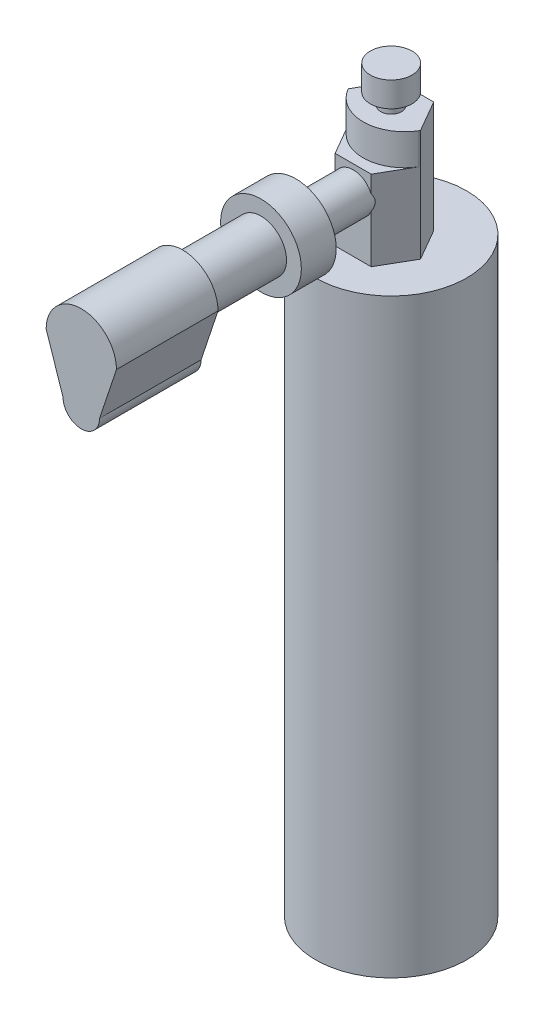
ISO-10303-21;
HEADER;
FILE_DESCRIPTION(('STEP AP214'),'2;1');
FILE_NAME('part.step','',(''),(''),'','','');
FILE_SCHEMA(('AUTOMOTIVE_DESIGN { 1 0 10303 214 1 1 1 1 }'));
ENDSEC;
DATA;
#1=APPLICATION_CONTEXT('core data for automotive mechanical design processes');
#2=APPLICATION_PROTOCOL_DEFINITION('international standard','automotive_design',2000,#1);
#3=PRODUCT_CONTEXT('',#1,'mechanical');
#4=PRODUCT('Part','Part','',(#3));
#5=PRODUCT_RELATED_PRODUCT_CATEGORY('part','',(#4));
#6=PRODUCT_DEFINITION_FORMATION('','',#4);
#7=PRODUCT_DEFINITION_CONTEXT('part definition',#1,'design');
#8=PRODUCT_DEFINITION('design','',#6,#7);
#9=PRODUCT_DEFINITION_SHAPE('','',#8);
#10=(LENGTH_UNIT() NAMED_UNIT(*) SI_UNIT(.MILLI.,.METRE.));
#11=(NAMED_UNIT(*) PLANE_ANGLE_UNIT() SI_UNIT($,.RADIAN.));
#12=(NAMED_UNIT(*) SI_UNIT($,.STERADIAN.) SOLID_ANGLE_UNIT());
#13=UNCERTAINTY_MEASURE_WITH_UNIT(LENGTH_MEASURE(1.E-05),#10,'distance_accuracy_value','');
#14=(GEOMETRIC_REPRESENTATION_CONTEXT(3) GLOBAL_UNCERTAINTY_ASSIGNED_CONTEXT((#13)) GLOBAL_UNIT_ASSIGNED_CONTEXT((#10,
#11,#12)) REPRESENTATION_CONTEXT('',''));
#15=CARTESIAN_POINT('',(0.,0.,0.));
#16=DIRECTION('',(0.,0.,1.));
#17=DIRECTION('',(1.,0.,0.));
#18=AXIS2_PLACEMENT_3D('',#15,#16,#17);
#19=CARTESIAN_POINT('',(0.,124.05,25.));
#20=DIRECTION('',(0.,0.,1.));
#21=DIRECTION('',(1.,0.,0.));
#22=AXIS2_PLACEMENT_3D('',#19,#20,#21);
#23=PLANE('',#22);
#24=CARTESIAN_POINT('',(0.,124.05,25.));
#25=DIRECTION('',(0.,0.,1.));
#26=DIRECTION('',(1.,0.,0.));
#27=AXIS2_PLACEMENT_3D('',#24,#25,#26);
#28=CIRCLE('',#27,7.75);
#29=CARTESIAN_POINT('',(7.75,124.05,25.));
#30=VERTEX_POINT('',#29);
#31=EDGE_CURVE('E169',#30,#30,#28,.T.);
#32=ORIENTED_EDGE('',*,*,#31,.T.);
#33=EDGE_LOOP('',(#32));
#34=FACE_BOUND('',#33,.T.);
#35=CARTESIAN_POINT('',(0.,124.05,25.));
#36=DIRECTION('',(0.,0.,1.));
#37=DIRECTION('',(1.,0.,0.));
#38=AXIS2_PLACEMENT_3D('',#35,#36,#37);
#39=CIRCLE('',#38,4.9);
#40=CARTESIAN_POINT('',(4.9,124.05,25.));
#41=VERTEX_POINT('',#40);
#42=EDGE_CURVE('E157',#41,#41,#39,.T.);
#43=ORIENTED_EDGE('',*,*,#42,.F.);
#44=EDGE_LOOP('',(#43));
#45=FACE_BOUND('',#44,.T.);
#46=ADVANCED_FACE('F32',(#34,#45),#23,.T.);
#47=CARTESIAN_POINT('',(-3.46410161513775,134.8,7.29999999999999));
#48=DIRECTION('',(0.,0.,-1.));
#49=DIRECTION('',(-1.,0.,0.));
#50=AXIS2_PLACEMENT_3D('',#47,#48,#49);
#51=PLANE('',#50);
#52=DIRECTION('',(0.,-1.,0.));
#53=VECTOR('',#52,1.);
#54=CARTESIAN_POINT('',(-3.46410161513775,134.8,7.29999999999999));
#55=LINE('',#54,#53);
#56=CARTESIAN_POINT('',(-3.46410161513775,128.8,7.29999999999999));
#57=VERTEX_POINT('',#56);
#58=CARTESIAN_POINT('',(-3.46410161513775,125.486140661634,7.29999999999999));
#59=VERTEX_POINT('',#58);
#60=EDGE_CURVE('E229',#57,#59,#55,.T.);
#61=ORIENTED_EDGE('',*,*,#60,.T.);
#62=CARTESIAN_POINT('',(0.,124.05,7.29999999999999));
#63=DIRECTION('',(0.,0.,-1.));
#64=DIRECTION('',(-1.,0.,0.));
#65=AXIS2_PLACEMENT_3D('',#62,#63,#64);
#66=CIRCLE('',#65,3.75);
#67=CARTESIAN_POINT('',(3.46410161513775,125.486140661634,7.29999999999999));
#68=VERTEX_POINT('',#67);
#69=EDGE_CURVE('E178',#59,#68,#66,.T.);
#70=ORIENTED_EDGE('',*,*,#69,.T.);
#71=DIRECTION('',(0.,-1.,0.));
#72=VECTOR('',#71,1.);
#73=CARTESIAN_POINT('',(3.46410161513775,134.8,7.29999999999999));
#74=LINE('',#73,#72);
#75=CARTESIAN_POINT('',(3.46410161513775,128.8,7.29999999999999));
#76=VERTEX_POINT('',#75);
#77=EDGE_CURVE('E225',#76,#68,#74,.T.);
#78=ORIENTED_EDGE('',*,*,#77,.F.);
#79=DIRECTION('',(1.,0.,0.));
#80=VECTOR('',#79,1.);
#81=CARTESIAN_POINT('',(-3.46410161513775,128.8,7.29999999999999));
#82=LINE('',#81,#80);
#83=EDGE_CURVE('E54',#57,#76,#82,.T.);
#84=ORIENTED_EDGE('',*,*,#83,.F.);
#85=EDGE_LOOP('',(#61,#70,#78,#84));
#86=FACE_BOUND('',#85,.T.);
#87=ADVANCED_FACE('F281',(#86),#51,.F.);
#88=CARTESIAN_POINT('',(3.46410161513775,122.613859338366,7.29999999999999));
#89=VERTEX_POINT('',#88);
#90=CARTESIAN_POINT('',(3.46410161513775,113.4,7.29999999999999));
#91=VERTEX_POINT('',#90);
#92=EDGE_CURVE('E224',#89,#91,#74,.T.);
#93=ORIENTED_EDGE('',*,*,#92,.F.);
#94=CARTESIAN_POINT('',(-3.46410161513775,122.613859338366,7.29999999999999));
#95=VERTEX_POINT('',#94);
#96=EDGE_CURVE('E47',#89,#95,#66,.T.);
#97=ORIENTED_EDGE('',*,*,#96,.T.);
#98=CARTESIAN_POINT('',(-3.46410161513775,113.4,7.29999999999999));
#99=VERTEX_POINT('',#98);
#100=EDGE_CURVE('E228',#95,#99,#55,.T.);
#101=ORIENTED_EDGE('',*,*,#100,.T.);
#102=DIRECTION('',(1.,0.,0.));
#103=VECTOR('',#102,1.);
#104=CARTESIAN_POINT('',(-3.46410161513775,113.4,7.29999999999999));
#105=LINE('',#104,#103);
#106=EDGE_CURVE('E218',#99,#91,#105,.T.);
#107=ORIENTED_EDGE('',*,*,#106,.T.);
#108=EDGE_LOOP('',(#93,#97,#101,#107));
#109=FACE_BOUND('',#108,.T.);
#110=ADVANCED_FACE('F286',(#109),#51,.F.);
#111=CARTESIAN_POINT('',(0.,141.9,0.));
#112=DIRECTION('',(0.,-1.,0.));
#113=DIRECTION('',(0.,0.,-1.));
#114=AXIS2_PLACEMENT_3D('',#111,#112,#113);
#115=CYLINDRICAL_SURFACE('',#114,2.);
#116=CARTESIAN_POINT('',(0.,134.8,0.));
#117=DIRECTION('',(0.,1.,0.));
#118=DIRECTION('',(0.,0.,1.));
#119=AXIS2_PLACEMENT_3D('',#116,#117,#118);
#120=CIRCLE('',#119,2.);
#121=CARTESIAN_POINT('',(0.,134.8,-2.));
#122=VERTEX_POINT('',#121);
#123=EDGE_CURVE('E239',#122,#122,#120,.T.);
#124=CARTESIAN_POINT('',(0.,137.1,0.));
#125=DIRECTION('',(0.,1.,0.));
#126=DIRECTION('',(0.,0.,1.));
#127=AXIS2_PLACEMENT_3D('',#124,#125,#126);
#128=CIRCLE('',#127,2.);
#129=CARTESIAN_POINT('',(0.,137.1,-2.));
#130=VERTEX_POINT('',#129);
#131=EDGE_CURVE('E250',#130,#130,#128,.T.);
#132=CARTESIAN_POINT('',(0.,134.8,-2.));
#133=CARTESIAN_POINT('',(0.,134.823958333333,-2.));
#134=CARTESIAN_POINT('',(0.,134.847916666667,-2.));
#135=CARTESIAN_POINT('',(0.,134.895833333333,-2.));
#136=CARTESIAN_POINT('',(0.,134.919791666667,-2.));
#137=CARTESIAN_POINT('',(0.,134.967708333333,-2.));
#138=CARTESIAN_POINT('',(0.,134.991666666667,-2.));
#139=CARTESIAN_POINT('',(0.,135.039583333333,-2.));
#140=CARTESIAN_POINT('',(0.,135.063541666667,-2.));
#141=CARTESIAN_POINT('',(0.,135.111458333333,-2.));
#142=CARTESIAN_POINT('',(0.,135.135416666667,-2.));
#143=CARTESIAN_POINT('',(0.,135.183333333333,-2.));
#144=CARTESIAN_POINT('',(0.,135.207291666667,-2.));
#145=CARTESIAN_POINT('',(0.,135.255208333333,-2.));
#146=CARTESIAN_POINT('',(0.,135.279166666667,-2.));
#147=CARTESIAN_POINT('',(0.,135.327083333333,-2.));
#148=CARTESIAN_POINT('',(0.,135.351041666667,-2.));
#149=CARTESIAN_POINT('',(0.,135.398958333333,-2.));
#150=CARTESIAN_POINT('',(0.,135.422916666667,-2.));
#151=CARTESIAN_POINT('',(0.,135.470833333333,-2.));
#152=CARTESIAN_POINT('',(0.,135.494791666667,-2.));
#153=CARTESIAN_POINT('',(0.,135.542708333333,-2.));
#154=CARTESIAN_POINT('',(0.,135.566666666667,-2.));
#155=CARTESIAN_POINT('',(0.,135.614583333333,-2.));
#156=CARTESIAN_POINT('',(0.,135.638541666667,-2.));
#157=CARTESIAN_POINT('',(0.,135.686458333333,-2.));
#158=CARTESIAN_POINT('',(0.,135.710416666667,-2.));
#159=CARTESIAN_POINT('',(0.,135.758333333333,-2.));
#160=CARTESIAN_POINT('',(0.,135.782291666667,-2.));
#161=CARTESIAN_POINT('',(0.,135.830208333333,-2.));
#162=CARTESIAN_POINT('',(0.,135.854166666667,-2.));
#163=CARTESIAN_POINT('',(0.,135.902083333333,-2.));
#164=CARTESIAN_POINT('',(0.,135.926041666667,-2.));
#165=CARTESIAN_POINT('',(0.,135.973958333333,-2.));
#166=CARTESIAN_POINT('',(0.,135.997916666667,-2.));
#167=CARTESIAN_POINT('',(0.,136.045833333333,-2.));
#168=CARTESIAN_POINT('',(0.,136.069791666667,-2.));
#169=CARTESIAN_POINT('',(0.,136.117708333333,-2.));
#170=CARTESIAN_POINT('',(0.,136.141666666667,-2.));
#171=CARTESIAN_POINT('',(0.,136.189583333333,-2.));
#172=CARTESIAN_POINT('',(0.,136.213541666667,-2.));
#173=CARTESIAN_POINT('',(0.,136.261458333333,-2.));
#174=CARTESIAN_POINT('',(0.,136.285416666667,-2.));
#175=CARTESIAN_POINT('',(0.,136.333333333333,-2.));
#176=CARTESIAN_POINT('',(0.,136.357291666667,-2.));
#177=CARTESIAN_POINT('',(0.,136.405208333333,-2.));
#178=CARTESIAN_POINT('',(0.,136.429166666667,-2.));
#179=CARTESIAN_POINT('',(0.,136.477083333333,-2.));
#180=CARTESIAN_POINT('',(0.,136.501041666667,-2.));
#181=CARTESIAN_POINT('',(0.,136.548958333333,-2.));
#182=CARTESIAN_POINT('',(0.,136.572916666667,-2.));
#183=CARTESIAN_POINT('',(0.,136.620833333333,-2.));
#184=CARTESIAN_POINT('',(0.,136.644791666667,-2.));
#185=CARTESIAN_POINT('',(0.,136.692708333333,-2.));
#186=CARTESIAN_POINT('',(0.,136.716666666667,-2.));
#187=CARTESIAN_POINT('',(0.,136.764583333333,-2.));
#188=CARTESIAN_POINT('',(0.,136.788541666667,-2.));
#189=CARTESIAN_POINT('',(0.,136.836458333333,-2.));
#190=CARTESIAN_POINT('',(0.,136.860416666667,-2.));
#191=CARTESIAN_POINT('',(0.,136.908333333333,-2.));
#192=CARTESIAN_POINT('',(0.,136.932291666667,-2.));
#193=CARTESIAN_POINT('',(0.,136.980208333333,-2.));
#194=CARTESIAN_POINT('',(0.,137.004166666667,-2.));
#195=CARTESIAN_POINT('',(0.,137.052083333333,-2.));
#196=CARTESIAN_POINT('',(0.,137.076041666667,-2.));
#197=CARTESIAN_POINT('',(0.,137.1,-2.));
#198=B_SPLINE_CURVE_WITH_KNOTS('',3,(#132,#133,#134,#135,#136,#137,#138,#139,#140,#141,#142,
#143,#144,#145,#146,#147,#148,#149,#150,#151,#152,#153,#154,#155,#156,#157,#158,#159,#160,#161,
#162,#163,#164,#165,#166,#167,#168,#169,#170,#171,#172,#173,#174,#175,#176,#177,#178,#179,#180,
#181,#182,#183,#184,#185,#186,#187,#188,#189,#190,#191,#192,#193,#194,#195,#196,#197),
.UNSPECIFIED.,.F.,.F.,(4,2,2,2,2,2,2,2,2,2,2,2,2,2,2,2,2,2,2,2,2,2,2,2,2,2,2,2,2,2,2,2,4),(0.,
0.071874999999999,0.143749999999998,0.215624999999997,0.287499999999996,0.359374999999995,
0.431249999999994,0.503124999999993,0.574999999999992,0.646874999999991,0.71874999999999,
0.790624999999989,0.862499999999988,0.934374999999987,1.00624999999999,1.07812499999999,
1.14999999999998,1.22187499999998,1.29374999999998,1.36562499999998,1.43749999999998,
1.50937499999998,1.58124999999998,1.65312499999998,1.72499999999998,1.79687499999998,
1.86874999999997,1.94062499999997,2.01249999999997,2.08437499999997,2.15624999999997,
2.22812499999997,2.29999999999997),.UNSPECIFIED.);
#199=EDGE_CURVE('BSEAM345',#122,#130,#198,.T.);
#200=ORIENTED_EDGE('',*,*,#123,.T.);
#201=ORIENTED_EDGE('',*,*,#131,.F.);
#202=ORIENTED_EDGE('',*,*,#199,.T.);
#203=ORIENTED_EDGE('',*,*,#199,.F.);
#204=EDGE_LOOP('',(#200,#202,#201,#203));
#205=FACE_BOUND('',#204,.T.);
#206=ADVANCED_FACE('F345',(#205),#115,.T.);
#207=CARTESIAN_POINT('',(0.,137.1,0.));
#208=DIRECTION('',(0.,1.,0.));
#209=DIRECTION('',(0.,0.,1.));
#210=AXIS2_PLACEMENT_3D('',#207,#208,#209);
#211=PLANE('',#210);
#212=CARTESIAN_POINT('',(0.,137.1,0.));
#213=DIRECTION('',(0.,1.,0.));
#214=DIRECTION('',(0.,0.,1.));
#215=AXIS2_PLACEMENT_3D('',#212,#213,#214);
#216=CIRCLE('',#215,4.);
#217=CARTESIAN_POINT('',(0.,137.1,4.));
#218=VERTEX_POINT('',#217);
#219=EDGE_CURVE('E240',#218,#218,#216,.T.);
#220=ORIENTED_EDGE('',*,*,#219,.F.);
#221=EDGE_LOOP('',(#220));
#222=FACE_BOUND('',#221,.T.);
#223=ORIENTED_EDGE('',*,*,#131,.T.);
#224=EDGE_LOOP('',(#223));
#225=FACE_BOUND('',#224,.T.);
#226=ADVANCED_FACE('F349',(#222,#225),#211,.F.);
#227=CARTESIAN_POINT('',(0.,137.1,0.));
#228=DIRECTION('',(0.,1.,0.));
#229=DIRECTION('',(0.,0.,1.));
#230=AXIS2_PLACEMENT_3D('',#227,#228,#229);
#231=CYLINDRICAL_SURFACE('',#230,4.);
#232=ORIENTED_EDGE('',*,*,#219,.T.);
#233=EDGE_LOOP('',(#232));
#234=FACE_BOUND('',#233,.T.);
#235=CARTESIAN_POINT('',(0.,141.9,0.));
#236=DIRECTION('',(0.,1.,0.));
#237=DIRECTION('',(0.,0.,1.));
#238=AXIS2_PLACEMENT_3D('',#235,#236,#237);
#239=CIRCLE('',#238,4.);
#240=CARTESIAN_POINT('',(0.,141.9,4.));
#241=VERTEX_POINT('',#240);
#242=EDGE_CURVE('E244',#241,#241,#239,.T.);
#243=ORIENTED_EDGE('',*,*,#242,.F.);
#244=EDGE_LOOP('',(#243));
#245=FACE_BOUND('',#244,.T.);
#246=ADVANCED_FACE('F355',(#234,#245),#231,.T.);
#247=CARTESIAN_POINT('',(0.,141.9,0.));
#248=DIRECTION('',(0.,1.,0.));
#249=DIRECTION('',(0.,0.,1.));
#250=AXIS2_PLACEMENT_3D('',#247,#248,#249);
#251=PLANE('',#250);
#252=ORIENTED_EDGE('',*,*,#242,.T.);
#253=EDGE_LOOP('',(#252));
#254=FACE_BOUND('',#253,.T.);
#255=ADVANCED_FACE('F341',(#254),#251,.T.);
#256=CARTESIAN_POINT('',(0.,134.8,0.));
#257=DIRECTION('',(0.,1.,0.));
#258=DIRECTION('',(0.,0.,1.));
#259=AXIS2_PLACEMENT_3D('',#256,#257,#258);
#260=PLANE('',#259);
#261=CARTESIAN_POINT('',(0.,134.8,-2.56180589680589));
#262=DIRECTION('',(0.,-1.,0.));
#263=DIRECTION('',(0.,0.,1.));
#264=AXIS2_PLACEMENT_3D('',#261,#262,#263);
#265=CIRCLE('',#264,7.93180589680589);
#266=CARTESIAN_POINT('',(6.8085236262563,134.8,1.50729115479099));
#267=VERTEX_POINT('',#266);
#268=CARTESIAN_POINT('',(-6.80852362625624,134.8,1.50729115479109));
#269=VERTEX_POINT('',#268);
#270=EDGE_CURVE('E182',#267,#269,#265,.T.);
#271=ORIENTED_EDGE('',*,*,#270,.F.);
#272=DIRECTION('',(0.5,0.,-0.866025403784439));
#273=VECTOR('',#272,1.);
#274=CARTESIAN_POINT('',(3.46410161513775,134.8,7.29999999999999));
#275=LINE('',#274,#273);
#276=CARTESIAN_POINT('',(6.92820323027551,134.8,1.3));
#277=VERTEX_POINT('',#276);
#278=EDGE_CURVE('E205',#267,#277,#275,.T.);
#279=ORIENTED_EDGE('',*,*,#278,.T.);
#280=DIRECTION('',(-0.5,0.,-0.866025403784438));
#281=VECTOR('',#280,1.);
#282=CARTESIAN_POINT('',(6.92820323027551,134.8,1.3));
#283=LINE('',#282,#281);
#284=CARTESIAN_POINT('',(3.46410161513775,134.8,-4.7));
#285=VERTEX_POINT('',#284);
#286=EDGE_CURVE('E194',#277,#285,#283,.T.);
#287=ORIENTED_EDGE('',*,*,#286,.T.);
#288=DIRECTION('',(-1.,0.,0.));
#289=VECTOR('',#288,1.);
#290=CARTESIAN_POINT('',(3.46410161513775,134.8,-4.7));
#291=LINE('',#290,#289);
#292=CARTESIAN_POINT('',(-3.46410161513775,134.8,-4.7));
#293=VERTEX_POINT('',#292);
#294=EDGE_CURVE('E197',#285,#293,#291,.T.);
#295=ORIENTED_EDGE('',*,*,#294,.T.);
#296=DIRECTION('',(-0.5,0.,0.866025403784438));
#297=VECTOR('',#296,1.);
#298=CARTESIAN_POINT('',(-3.46410161513775,134.8,-4.7));
#299=LINE('',#298,#297);
#300=CARTESIAN_POINT('',(-6.92820323027551,134.8,1.3));
#301=VERTEX_POINT('',#300);
#302=EDGE_CURVE('E200',#293,#301,#299,.T.);
#303=ORIENTED_EDGE('',*,*,#302,.T.);
#304=DIRECTION('',(0.5,0.,0.866025403784438));
#305=VECTOR('',#304,1.);
#306=CARTESIAN_POINT('',(-6.92820323027551,134.8,1.3));
#307=LINE('',#306,#305);
#308=EDGE_CURVE('E202',#301,#269,#307,.T.);
#309=ORIENTED_EDGE('',*,*,#308,.T.);
#310=EDGE_LOOP('',(#271,#279,#287,#295,#303,#309));
#311=FACE_BOUND('',#310,.T.);
#312=ORIENTED_EDGE('',*,*,#123,.F.);
#313=EDGE_LOOP('',(#312));
#314=FACE_BOUND('',#313,.T.);
#315=ADVANCED_FACE('F269',(#311,#314),#260,.T.);
#316=CARTESIAN_POINT('',(6.92820323027551,134.8,1.3));
#317=DIRECTION('',(-0.866025403784439,0.,0.5));
#318=DIRECTION('',(0.5,0.,0.866025403784439));
#319=AXIS2_PLACEMENT_3D('',#316,#317,#318);
#320=PLANE('',#319);
#321=DIRECTION('',(-0.5,0.,-0.866025403784438));
#322=VECTOR('',#321,1.);
#323=CARTESIAN_POINT('',(6.92820323027551,113.4,1.3));
#324=LINE('',#323,#322);
#325=CARTESIAN_POINT('',(6.92820323027551,113.4,1.3));
#326=VERTEX_POINT('',#325);
#327=CARTESIAN_POINT('',(3.46410161513775,113.4,-4.7));
#328=VERTEX_POINT('',#327);
#329=EDGE_CURVE('E193',#326,#328,#324,.T.);
#330=ORIENTED_EDGE('',*,*,#329,.T.);
#331=DIRECTION('',(0.,-1.,0.));
#332=VECTOR('',#331,1.);
#333=CARTESIAN_POINT('',(3.46410161513775,134.8,-4.7));
#334=LINE('',#333,#332);
#335=EDGE_CURVE('E237',#285,#328,#334,.T.);
#336=ORIENTED_EDGE('',*,*,#335,.F.);
#337=ORIENTED_EDGE('',*,*,#286,.F.);
#338=DIRECTION('',(0.,-1.,0.));
#339=VECTOR('',#338,1.);
#340=CARTESIAN_POINT('',(6.92820323027551,134.8,1.3));
#341=LINE('',#340,#339);
#342=EDGE_CURVE('E207',#277,#326,#341,.T.);
#343=ORIENTED_EDGE('',*,*,#342,.T.);
#344=EDGE_LOOP('',(#330,#336,#337,#343));
#345=FACE_BOUND('',#344,.T.);
#346=ADVANCED_FACE('F297',(#345),#320,.F.);
#347=CARTESIAN_POINT('',(3.46410161513775,134.8,-4.7));
#348=DIRECTION('',(0.,0.,1.));
#349=DIRECTION('',(1.,0.,0.));
#350=AXIS2_PLACEMENT_3D('',#347,#348,#349);
#351=PLANE('',#350);
#352=DIRECTION('',(-1.,0.,0.));
#353=VECTOR('',#352,1.);
#354=CARTESIAN_POINT('',(3.46410161513775,113.4,-4.7));
#355=LINE('',#354,#353);
#356=CARTESIAN_POINT('',(-3.46410161513775,113.4,-4.7));
#357=VERTEX_POINT('',#356);
#358=EDGE_CURVE('E210',#328,#357,#355,.T.);
#359=ORIENTED_EDGE('',*,*,#358,.T.);
#360=DIRECTION('',(0.,-1.,0.));
#361=VECTOR('',#360,1.);
#362=CARTESIAN_POINT('',(-3.46410161513775,134.8,-4.7));
#363=LINE('',#362,#361);
#364=EDGE_CURVE('E234',#293,#357,#363,.T.);
#365=ORIENTED_EDGE('',*,*,#364,.F.);
#366=ORIENTED_EDGE('',*,*,#294,.F.);
#367=ORIENTED_EDGE('',*,*,#335,.T.);
#368=EDGE_LOOP('',(#359,#365,#366,#367));
#369=FACE_BOUND('',#368,.T.);
#370=ADVANCED_FACE('F300',(#369),#351,.F.);
#371=CARTESIAN_POINT('',(-3.46410161513775,134.8,-4.7));
#372=DIRECTION('',(0.866025403784439,0.,0.5));
#373=DIRECTION('',(0.5,0.,-0.866025403784439));
#374=AXIS2_PLACEMENT_3D('',#371,#372,#373);
#375=PLANE('',#374);
#376=DIRECTION('',(-0.5,0.,0.866025403784438));
#377=VECTOR('',#376,1.);
#378=CARTESIAN_POINT('',(-3.46410161513775,113.4,-4.7));
#379=LINE('',#378,#377);
#380=CARTESIAN_POINT('',(-6.92820323027551,113.4,1.3));
#381=VERTEX_POINT('',#380);
#382=EDGE_CURVE('E212',#357,#381,#379,.T.);
#383=ORIENTED_EDGE('',*,*,#382,.T.);
#384=DIRECTION('',(0.,-1.,0.));
#385=VECTOR('',#384,1.);
#386=CARTESIAN_POINT('',(-6.92820323027551,134.8,1.3));
#387=LINE('',#386,#385);
#388=EDGE_CURVE('E232',#301,#381,#387,.T.);
#389=ORIENTED_EDGE('',*,*,#388,.F.);
#390=ORIENTED_EDGE('',*,*,#302,.F.);
#391=ORIENTED_EDGE('',*,*,#364,.T.);
#392=EDGE_LOOP('',(#383,#389,#390,#391));
#393=FACE_BOUND('',#392,.T.);
#394=ADVANCED_FACE('F302',(#393),#375,.F.);
#395=CARTESIAN_POINT('',(-6.92820323027551,134.8,1.3));
#396=DIRECTION('',(0.866025403784438,0.,-0.5));
#397=DIRECTION('',(-0.5,0.,-0.866025403784438));
#398=AXIS2_PLACEMENT_3D('',#395,#396,#397);
#399=PLANE('',#398);
#400=ORIENTED_EDGE('',*,*,#100,.F.);
#401=CARTESIAN_POINT('',(0.,124.05,13.3));
#402=DIRECTION('',(0.866025403784438,0.,-0.5));
#403=DIRECTION('',(0.5,0.,0.866025403784438));
#404=AXIS2_PLACEMENT_3D('',#401,#402,#403);
#405=ELLIPSE('',#404,7.49999999999999,3.75);
#406=EDGE_CURVE('E179',#95,#59,#405,.T.);
#407=ORIENTED_EDGE('',*,*,#406,.T.);
#408=ORIENTED_EDGE('',*,*,#60,.F.);
#409=DIRECTION('',(0.5,0.,0.866025403784438));
#410=VECTOR('',#409,1.);
#411=CARTESIAN_POINT('',(-6.92820323027551,128.8,1.3));
#412=LINE('',#411,#410);
#413=CARTESIAN_POINT('',(-6.80852362625624,128.8,1.50729115479109));
#414=VERTEX_POINT('',#413);
#415=EDGE_CURVE('E188',#414,#57,#412,.T.);
#416=ORIENTED_EDGE('',*,*,#415,.F.);
#417=DIRECTION('',(0.,1.,0.));
#418=VECTOR('',#417,1.);
#419=CARTESIAN_POINT('',(-6.80852362625624,128.8,1.50729115479109));
#420=LINE('',#419,#418);
#421=EDGE_CURVE('E190',#414,#269,#420,.T.);
#422=ORIENTED_EDGE('',*,*,#421,.T.);
#423=ORIENTED_EDGE('',*,*,#308,.F.);
#424=ORIENTED_EDGE('',*,*,#388,.T.);
#425=DIRECTION('',(0.5,0.,0.866025403784438));
#426=VECTOR('',#425,1.);
#427=CARTESIAN_POINT('',(-6.92820323027551,113.4,1.3));
#428=LINE('',#427,#426);
#429=EDGE_CURVE('E215',#381,#99,#428,.T.);
#430=ORIENTED_EDGE('',*,*,#429,.T.);
#431=EDGE_LOOP('',(#400,#407,#408,#416,#422,#423,#424,#430));
#432=FACE_BOUND('',#431,.T.);
#433=ADVANCED_FACE('F276',(#432),#399,.F.);
#434=CARTESIAN_POINT('',(3.46410161513775,134.8,7.29999999999999));
#435=DIRECTION('',(-0.866025403784439,0.,-0.5));
#436=DIRECTION('',(-0.5,0.,0.866025403784439));
#437=AXIS2_PLACEMENT_3D('',#434,#435,#436);
#438=PLANE('',#437);
#439=ORIENTED_EDGE('',*,*,#77,.T.);
#440=CARTESIAN_POINT('',(0.,124.05,13.3));
#441=DIRECTION('',(-0.866025403784439,0.,-0.5));
#442=DIRECTION('',(-0.5,0.,0.866025403784439));
#443=AXIS2_PLACEMENT_3D('',#440,#441,#442);
#444=ELLIPSE('',#443,7.5,3.75);
#445=EDGE_CURVE('E11',#68,#89,#444,.T.);
#446=ORIENTED_EDGE('',*,*,#445,.T.);
#447=ORIENTED_EDGE('',*,*,#92,.T.);
#448=DIRECTION('',(0.5,0.,-0.866025403784439));
#449=VECTOR('',#448,1.);
#450=CARTESIAN_POINT('',(3.46410161513775,113.4,7.29999999999999));
#451=LINE('',#450,#449);
#452=EDGE_CURVE('E198',#91,#326,#451,.T.);
#453=ORIENTED_EDGE('',*,*,#452,.T.);
#454=ORIENTED_EDGE('',*,*,#342,.F.);
#455=ORIENTED_EDGE('',*,*,#278,.F.);
#456=DIRECTION('',(0.,1.,0.));
#457=VECTOR('',#456,1.);
#458=CARTESIAN_POINT('',(6.80852362625624,128.8,1.50729115479109));
#459=LINE('',#458,#457);
#460=CARTESIAN_POINT('',(6.8085236262563,128.8,1.50729115479099));
#461=VERTEX_POINT('',#460);
#462=EDGE_CURVE('E40',#267,#461,#459,.F.);
#463=ORIENTED_EDGE('',*,*,#462,.T.);
#464=DIRECTION('',(0.5,0.,-0.866025403784439));
#465=VECTOR('',#464,1.);
#466=CARTESIAN_POINT('',(3.46410161513775,128.8,7.29999999999999));
#467=LINE('',#466,#465);
#468=EDGE_CURVE('E255',#76,#461,#467,.T.);
#469=ORIENTED_EDGE('',*,*,#468,.F.);
#470=EDGE_LOOP('',(#439,#446,#447,#453,#454,#455,#463,#469));
#471=FACE_BOUND('',#470,.T.);
#472=ADVANCED_FACE('F261',(#471),#438,.F.);
#473=CARTESIAN_POINT('',(0.,0.,0.));
#474=DIRECTION('',(0.,1.,0.));
#475=DIRECTION('',(0.,0.,1.));
#476=AXIS2_PLACEMENT_3D('',#473,#474,#475);
#477=PLANE('',#476);
#478=CARTESIAN_POINT('',(0.,0.,0.));
#479=DIRECTION('',(0.,1.,0.));
#480=DIRECTION('',(0.,0.,1.));
#481=AXIS2_PLACEMENT_3D('',#478,#479,#480);
#482=CIRCLE('',#481,14.5);
#483=CARTESIAN_POINT('',(0.,0.,-14.5));
#484=VERTEX_POINT('',#483);
#485=EDGE_CURVE('E243',#484,#484,#482,.T.);
#486=ORIENTED_EDGE('',*,*,#485,.F.);
#487=EDGE_LOOP('',(#486));
#488=FACE_BOUND('',#487,.T.);
#489=ADVANCED_FACE('F343',(#488),#477,.F.);
#490=CARTESIAN_POINT('',(0.,113.4,0.));
#491=DIRECTION('',(0.,-1.,0.));
#492=DIRECTION('',(0.,0.,-1.));
#493=AXIS2_PLACEMENT_3D('',#490,#491,#492);
#494=CYLINDRICAL_SURFACE('',#493,14.5);
#495=CARTESIAN_POINT('',(0.,113.4,0.));
#496=DIRECTION('',(0.,1.,0.));
#497=DIRECTION('',(0.,0.,1.));
#498=AXIS2_PLACEMENT_3D('',#495,#496,#497);
#499=CIRCLE('',#498,14.5);
#500=CARTESIAN_POINT('',(0.,113.4,-14.5));
#501=VERTEX_POINT('',#500);
#502=EDGE_CURVE('E247',#501,#501,#499,.T.);
#503=CARTESIAN_POINT('',(0.,113.4,-14.5));
#504=CARTESIAN_POINT('',(0.,112.21875,-14.5));
#505=CARTESIAN_POINT('',(0.,111.0375,-14.5));
#506=CARTESIAN_POINT('',(0.,108.675,-14.5));
#507=CARTESIAN_POINT('',(0.,107.49375,-14.5));
#508=CARTESIAN_POINT('',(0.,105.13125,-14.5));
#509=CARTESIAN_POINT('',(0.,103.95,-14.5));
#510=CARTESIAN_POINT('',(0.,101.5875,-14.5));
#511=CARTESIAN_POINT('',(0.,100.40625,-14.5));
#512=CARTESIAN_POINT('',(0.,98.04375,-14.5));
#513=CARTESIAN_POINT('',(0.,96.8625,-14.5));
#514=CARTESIAN_POINT('',(0.,94.5,-14.5));
#515=CARTESIAN_POINT('',(0.,93.31875,-14.5));
#516=CARTESIAN_POINT('',(0.,90.95625,-14.5));
#517=CARTESIAN_POINT('',(0.,89.775,-14.5));
#518=CARTESIAN_POINT('',(0.,87.4125,-14.5));
#519=CARTESIAN_POINT('',(0.,86.23125,-14.5));
#520=CARTESIAN_POINT('',(0.,83.86875,-14.5));
#521=CARTESIAN_POINT('',(0.,82.6875,-14.5));
#522=CARTESIAN_POINT('',(0.,80.325,-14.5));
#523=CARTESIAN_POINT('',(0.,79.14375,-14.5));
#524=CARTESIAN_POINT('',(0.,76.78125,-14.5));
#525=CARTESIAN_POINT('',(0.,75.6,-14.5));
#526=CARTESIAN_POINT('',(0.,73.2375,-14.5));
#527=CARTESIAN_POINT('',(0.,72.05625,-14.5));
#528=CARTESIAN_POINT('',(0.,69.69375,-14.5));
#529=CARTESIAN_POINT('',(0.,68.5125,-14.5));
#530=CARTESIAN_POINT('',(0.,66.15,-14.5));
#531=CARTESIAN_POINT('',(0.,64.96875,-14.5));
#532=CARTESIAN_POINT('',(0.,62.60625,-14.5));
#533=CARTESIAN_POINT('',(0.,61.425,-14.5));
#534=CARTESIAN_POINT('',(0.,59.0625,-14.5));
#535=CARTESIAN_POINT('',(0.,57.88125,-14.5));
#536=CARTESIAN_POINT('',(0.,55.51875,-14.5));
#537=CARTESIAN_POINT('',(0.,54.3375,-14.5));
#538=CARTESIAN_POINT('',(0.,51.975,-14.5));
#539=CARTESIAN_POINT('',(0.,50.79375,-14.5));
#540=CARTESIAN_POINT('',(0.,48.43125,-14.5));
#541=CARTESIAN_POINT('',(0.,47.25,-14.5));
#542=CARTESIAN_POINT('',(0.,44.8875,-14.5));
#543=CARTESIAN_POINT('',(0.,43.70625,-14.5));
#544=CARTESIAN_POINT('',(0.,41.34375,-14.5));
#545=CARTESIAN_POINT('',(0.,40.1625,-14.5));
#546=CARTESIAN_POINT('',(0.,37.8,-14.5));
#547=CARTESIAN_POINT('',(0.,36.61875,-14.5));
#548=CARTESIAN_POINT('',(0.,34.25625,-14.5));
#549=CARTESIAN_POINT('',(0.,33.075,-14.5));
#550=CARTESIAN_POINT('',(0.,30.7125,-14.5));
#551=CARTESIAN_POINT('',(0.,29.53125,-14.5));
#552=CARTESIAN_POINT('',(0.,27.16875,-14.5));
#553=CARTESIAN_POINT('',(0.,25.9875,-14.5));
#554=CARTESIAN_POINT('',(0.,23.625,-14.5));
#555=CARTESIAN_POINT('',(0.,22.44375,-14.5));
#556=CARTESIAN_POINT('',(0.,20.08125,-14.5));
#557=CARTESIAN_POINT('',(0.,18.9,-14.5));
#558=CARTESIAN_POINT('',(0.,16.5375,-14.5));
#559=CARTESIAN_POINT('',(0.,15.35625,-14.5));
#560=CARTESIAN_POINT('',(0.,12.99375,-14.5));
#561=CARTESIAN_POINT('',(0.,11.8125,-14.5));
#562=CARTESIAN_POINT('',(0.,9.44999999999998,-14.5));
#563=CARTESIAN_POINT('',(0.,8.26874999999998,-14.5));
#564=CARTESIAN_POINT('',(0.,5.90624999999998,-14.5));
#565=CARTESIAN_POINT('',(0.,4.72499999999998,-14.5));
#566=CARTESIAN_POINT('',(0.,2.36249999999998,-14.5));
#567=CARTESIAN_POINT('',(0.,1.18124999999999,-14.5));
#568=CARTESIAN_POINT('',(0.,0.,-14.5));
#569=B_SPLINE_CURVE_WITH_KNOTS('',3,(#503,#504,#505,#506,#507,#508,#509,#510,#511,#512,#513,
#514,#515,#516,#517,#518,#519,#520,#521,#522,#523,#524,#525,#526,#527,#528,#529,#530,#531,#532,
#533,#534,#535,#536,#537,#538,#539,#540,#541,#542,#543,#544,#545,#546,#547,#548,#549,#550,#551,
#552,#553,#554,#555,#556,#557,#558,#559,#560,#561,#562,#563,#564,#565,#566,#567,#568),
.UNSPECIFIED.,.F.,.F.,(4,2,2,2,2,2,2,2,2,2,2,2,2,2,2,2,2,2,2,2,2,2,2,2,2,2,2,2,2,2,2,2,4),(0.,
3.54375,7.0875,10.63125,14.175,17.71875,21.2625,24.80625,28.35,31.89375,35.4375,38.98125,42.525,
46.06875,49.6125,53.15625,56.7,60.24375,63.7875,67.33125,70.875,74.41875,77.9625,81.50625,85.05,
88.59375,92.1375,95.68125,99.225,102.76875,106.3125,109.85625,113.4),.UNSPECIFIED.);
#570=EDGE_CURVE('BSEAM34',#501,#484,#569,.T.);
#571=ORIENTED_EDGE('',*,*,#502,.F.);
#572=ORIENTED_EDGE('',*,*,#485,.T.);
#573=ORIENTED_EDGE('',*,*,#570,.T.);
#574=ORIENTED_EDGE('',*,*,#570,.F.);
#575=EDGE_LOOP('',(#571,#573,#572,#574));
#576=FACE_BOUND('',#575,.T.);
#577=ADVANCED_FACE('F34',(#576),#494,.T.);
#578=CARTESIAN_POINT('',(0.,113.4,0.));
#579=DIRECTION('',(0.,1.,0.));
#580=DIRECTION('',(0.,0.,1.));
#581=AXIS2_PLACEMENT_3D('',#578,#579,#580);
#582=PLANE('',#581);
#583=ORIENTED_EDGE('',*,*,#502,.T.);
#584=EDGE_LOOP('',(#583));
#585=FACE_BOUND('',#584,.T.);
#586=ORIENTED_EDGE('',*,*,#358,.F.);
#587=ORIENTED_EDGE('',*,*,#329,.F.);
#588=ORIENTED_EDGE('',*,*,#452,.F.);
#589=ORIENTED_EDGE('',*,*,#106,.F.);
#590=ORIENTED_EDGE('',*,*,#429,.F.);
#591=ORIENTED_EDGE('',*,*,#382,.F.);
#592=EDGE_LOOP('',(#586,#587,#588,#589,#590,#591));
#593=FACE_BOUND('',#592,.T.);
#594=ADVANCED_FACE('F293',(#585,#593),#582,.T.);
#595=CARTESIAN_POINT('',(0.,128.8,-2.56180589680589));
#596=DIRECTION('',(0.,1.,0.));
#597=DIRECTION('',(0.,0.,1.));
#598=AXIS2_PLACEMENT_3D('',#595,#596,#597);
#599=CYLINDRICAL_SURFACE('',#598,7.93180589680589);
#600=CARTESIAN_POINT('',(0.,128.8,-2.56180589680589));
#601=DIRECTION('',(0.,-1.,0.));
#602=DIRECTION('',(0.,0.,1.));
#603=AXIS2_PLACEMENT_3D('',#600,#601,#602);
#604=CIRCLE('',#603,7.93180589680589);
#605=EDGE_CURVE('E183',#461,#414,#604,.T.);
#606=ORIENTED_EDGE('',*,*,#605,.F.);
#607=ORIENTED_EDGE('',*,*,#462,.F.);
#608=ORIENTED_EDGE('',*,*,#270,.T.);
#609=ORIENTED_EDGE('',*,*,#421,.F.);
#610=EDGE_LOOP('',(#606,#607,#608,#609));
#611=FACE_BOUND('',#610,.T.);
#612=ADVANCED_FACE('F267',(#611),#599,.T.);
#613=CARTESIAN_POINT('',(0.,128.8,-2.56180589680589));
#614=DIRECTION('',(0.,1.,0.));
#615=DIRECTION('',(0.,0.,1.));
#616=AXIS2_PLACEMENT_3D('',#613,#614,#615);
#617=PLANE('',#616);
#618=ORIENTED_EDGE('',*,*,#415,.T.);
#619=ORIENTED_EDGE('',*,*,#83,.T.);
#620=ORIENTED_EDGE('',*,*,#468,.T.);
#621=ORIENTED_EDGE('',*,*,#605,.T.);
#622=EDGE_LOOP('',(#618,#619,#620,#621));
#623=FACE_BOUND('',#622,.T.);
#624=ADVANCED_FACE('F279',(#623),#617,.T.);
#625=CARTESIAN_POINT('',(0.,124.05,5.29999999999999));
#626=DIRECTION('',(0.,0.,1.));
#627=DIRECTION('',(1.,0.,0.));
#628=AXIS2_PLACEMENT_3D('',#625,#626,#627);
#629=CYLINDRICAL_SURFACE('',#628,3.75);
#630=CARTESIAN_POINT('',(0.,124.05,18.3));
#631=DIRECTION('',(0.,0.,1.));
#632=DIRECTION('',(1.,0.,0.));
#633=AXIS2_PLACEMENT_3D('',#630,#631,#632);
#634=CIRCLE('',#633,3.75);
#635=CARTESIAN_POINT('',(3.75,124.05,18.3));
#636=VERTEX_POINT('',#635);
#637=EDGE_CURVE('E172',#636,#636,#634,.T.);
#638=ORIENTED_EDGE('',*,*,#637,.F.);
#639=EDGE_LOOP('',(#638));
#640=FACE_BOUND('',#639,.T.);
#641=ORIENTED_EDGE('',*,*,#406,.F.);
#642=ORIENTED_EDGE('',*,*,#96,.F.);
#643=ORIENTED_EDGE('',*,*,#445,.F.);
#644=ORIENTED_EDGE('',*,*,#69,.F.);
#645=EDGE_LOOP('',(#641,#642,#643,#644));
#646=FACE_BOUND('',#645,.T.);
#647=ADVANCED_FACE('F283',(#640,#646),#629,.T.);
#648=CARTESIAN_POINT('',(0.,124.05,25.));
#649=DIRECTION('',(0.,0.,-1.));
#650=DIRECTION('',(-1.,0.,0.));
#651=AXIS2_PLACEMENT_3D('',#648,#649,#650);
#652=CYLINDRICAL_SURFACE('',#651,7.75);
#653=ORIENTED_EDGE('',*,*,#31,.F.);
#654=EDGE_LOOP('',(#653));
#655=FACE_BOUND('',#654,.T.);
#656=CARTESIAN_POINT('',(0.,124.05,18.3));
#657=DIRECTION('',(0.,0.,1.));
#658=DIRECTION('',(1.,0.,0.));
#659=AXIS2_PLACEMENT_3D('',#656,#657,#658);
#660=CIRCLE('',#659,7.75);
#661=CARTESIAN_POINT('',(7.75,124.05,18.3));
#662=VERTEX_POINT('',#661);
#663=EDGE_CURVE('E167',#662,#662,#660,.T.);
#664=ORIENTED_EDGE('',*,*,#663,.T.);
#665=EDGE_LOOP('',(#664));
#666=FACE_BOUND('',#665,.T.);
#667=ADVANCED_FACE('F327',(#655,#666),#652,.T.);
#668=CARTESIAN_POINT('',(0.,124.05,18.3));
#669=DIRECTION('',(0.,0.,1.));
#670=DIRECTION('',(1.,0.,0.));
#671=AXIS2_PLACEMENT_3D('',#668,#669,#670);
#672=PLANE('',#671);
#673=ORIENTED_EDGE('',*,*,#637,.T.);
#674=EDGE_LOOP('',(#673));
#675=FACE_BOUND('',#674,.T.);
#676=ORIENTED_EDGE('',*,*,#663,.F.);
#677=EDGE_LOOP('',(#676));
#678=FACE_BOUND('',#677,.T.);
#679=ADVANCED_FACE('F324',(#675,#678),#672,.F.);
#680=CARTESIAN_POINT('',(0.,124.05,40.));
#681=DIRECTION('',(0.,0.,-1.));
#682=DIRECTION('',(-1.,0.,0.));
#683=AXIS2_PLACEMENT_3D('',#680,#681,#682);
#684=CYLINDRICAL_SURFACE('',#683,4.9);
#685=CARTESIAN_POINT('',(0.,124.05,40.));
#686=DIRECTION('',(0.,0.,1.));
#687=DIRECTION('',(1.,0.,0.));
#688=AXIS2_PLACEMENT_3D('',#685,#686,#687);
#689=CIRCLE('',#688,4.9);
#690=CARTESIAN_POINT('',(4.9,124.05,40.));
#691=VERTEX_POINT('',#690);
#692=EDGE_CURVE('E160',#691,#691,#689,.T.);
#693=ORIENTED_EDGE('',*,*,#692,.F.);
#694=EDGE_LOOP('',(#693));
#695=FACE_BOUND('',#694,.T.);
#696=ORIENTED_EDGE('',*,*,#42,.T.);
#697=EDGE_LOOP('',(#696));
#698=FACE_BOUND('',#697,.T.);
#699=ADVANCED_FACE('F322',(#695,#698),#684,.T.);
#700=CARTESIAN_POINT('',(0.,124.05,40.));
#701=DIRECTION('',(0.,0.,1.));
#702=DIRECTION('',(1.,0.,0.));
#703=AXIS2_PLACEMENT_3D('',#700,#701,#702);
#704=PLANE('',#703);
#705=CARTESIAN_POINT('',(0.,124.05,40.));
#706=DIRECTION('',(0.,0.,1.));
#707=DIRECTION('',(1.,0.,0.));
#708=AXIS2_PLACEMENT_3D('',#705,#706,#707);
#709=CIRCLE('',#708,6.75);
#710=CARTESIAN_POINT('',(6.75,124.05,40.));
#711=VERTEX_POINT('',#710);
#712=CARTESIAN_POINT('',(-6.75,124.05,40.));
#713=VERTEX_POINT('',#712);
#714=EDGE_CURVE('E156',#711,#713,#709,.T.);
#715=ORIENTED_EDGE('',*,*,#714,.F.);
#716=DIRECTION('',(0.316227766016838,0.948683298050514,0.));
#717=VECTOR('',#716,1.);
#718=CARTESIAN_POINT('',(3.5,114.3,40.));
#719=LINE('',#718,#717);
#720=CARTESIAN_POINT('',(3.5,114.3,40.));
#721=VERTEX_POINT('',#720);
#722=EDGE_CURVE('E152',#721,#711,#719,.T.);
#723=ORIENTED_EDGE('',*,*,#722,.F.);
#724=CARTESIAN_POINT('',(0.,114.3,40.));
#725=DIRECTION('',(0.,0.,1.));
#726=DIRECTION('',(1.,0.,0.));
#727=AXIS2_PLACEMENT_3D('',#724,#725,#726);
#728=CIRCLE('',#727,3.5);
#729=CARTESIAN_POINT('',(-3.5,114.3,40.));
#730=VERTEX_POINT('',#729);
#731=EDGE_CURVE('E569',#730,#721,#728,.T.);
#732=ORIENTED_EDGE('',*,*,#731,.F.);
#733=DIRECTION('',(0.316227766016838,-0.948683298050514,0.));
#734=VECTOR('',#733,1.);
#735=CARTESIAN_POINT('',(-6.75,124.05,40.));
#736=LINE('',#735,#734);
#737=EDGE_CURVE('E573',#713,#730,#736,.T.);
#738=ORIENTED_EDGE('',*,*,#737,.F.);
#739=EDGE_LOOP('',(#715,#723,#732,#738));
#740=FACE_BOUND('',#739,.T.);
#741=ORIENTED_EDGE('',*,*,#692,.T.);
#742=EDGE_LOOP('',(#741));
#743=FACE_BOUND('',#742,.T.);
#744=ADVANCED_FACE('F409',(#740,#743),#704,.F.);
#745=CARTESIAN_POINT('',(0.,124.05,59.5));
#746=DIRECTION('',(0.,0.,-1.));
#747=DIRECTION('',(-1.,0.,0.));
#748=AXIS2_PLACEMENT_3D('',#745,#746,#747);
#749=CYLINDRICAL_SURFACE('',#748,6.75);
#750=ORIENTED_EDGE('',*,*,#714,.T.);
#751=DIRECTION('',(0.,0.,-1.));
#752=VECTOR('',#751,1.);
#753=CARTESIAN_POINT('',(-6.75,124.05,59.5));
#754=LINE('',#753,#752);
#755=CARTESIAN_POINT('',(-6.75,124.05,59.5));
#756=VERTEX_POINT('',#755);
#757=EDGE_CURVE('E136',#756,#713,#754,.T.);
#758=ORIENTED_EDGE('',*,*,#757,.F.);
#759=CARTESIAN_POINT('',(0.,124.05,59.5));
#760=DIRECTION('',(0.,0.,1.));
#761=DIRECTION('',(1.,0.,0.));
#762=AXIS2_PLACEMENT_3D('',#759,#760,#761);
#763=CIRCLE('',#762,6.75);
#764=CARTESIAN_POINT('',(6.75,124.05,59.5));
#765=VERTEX_POINT('',#764);
#766=EDGE_CURVE('E143',#765,#756,#763,.T.);
#767=ORIENTED_EDGE('',*,*,#766,.F.);
#768=DIRECTION('',(0.,0.,-1.));
#769=VECTOR('',#768,1.);
#770=CARTESIAN_POINT('',(6.75,124.05,59.5));
#771=LINE('',#770,#769);
#772=EDGE_CURVE('E566',#765,#711,#771,.T.);
#773=ORIENTED_EDGE('',*,*,#772,.T.);
#774=EDGE_LOOP('',(#750,#758,#767,#773));
#775=FACE_BOUND('',#774,.T.);
#776=ADVANCED_FACE('F154',(#775),#749,.T.);
#777=CARTESIAN_POINT('',(-6.75,124.05,59.5));
#778=DIRECTION('',(0.948683298050514,0.316227766016838,0.));
#779=DIRECTION('',(-0.316227766016838,0.948683298050514,0.));
#780=AXIS2_PLACEMENT_3D('',#777,#778,#779);
#781=PLANE('',#780);
#782=ORIENTED_EDGE('',*,*,#737,.T.);
#783=DIRECTION('',(0.,0.,-1.));
#784=VECTOR('',#783,1.);
#785=CARTESIAN_POINT('',(-3.5,114.3,59.5));
#786=LINE('',#785,#784);
#787=CARTESIAN_POINT('',(-3.5,114.3,59.5));
#788=VERTEX_POINT('',#787);
#789=EDGE_CURVE('E139',#788,#730,#786,.T.);
#790=ORIENTED_EDGE('',*,*,#789,.F.);
#791=DIRECTION('',(0.316227766016838,-0.948683298050514,0.));
#792=VECTOR('',#791,1.);
#793=CARTESIAN_POINT('',(-6.75,124.05,59.5));
#794=LINE('',#793,#792);
#795=EDGE_CURVE('E132',#756,#788,#794,.T.);
#796=ORIENTED_EDGE('',*,*,#795,.F.);
#797=ORIENTED_EDGE('',*,*,#757,.T.);
#798=EDGE_LOOP('',(#782,#790,#796,#797));
#799=FACE_BOUND('',#798,.T.);
#800=ADVANCED_FACE('F134',(#799),#781,.F.);
#801=CARTESIAN_POINT('',(0.,114.3,59.5));
#802=DIRECTION('',(0.,0.,-1.));
#803=DIRECTION('',(-1.,0.,0.));
#804=AXIS2_PLACEMENT_3D('',#801,#802,#803);
#805=CYLINDRICAL_SURFACE('',#804,3.5);
#806=ORIENTED_EDGE('',*,*,#731,.T.);
#807=DIRECTION('',(0.,0.,-1.));
#808=VECTOR('',#807,1.);
#809=CARTESIAN_POINT('',(3.5,114.3,59.5));
#810=LINE('',#809,#808);
#811=CARTESIAN_POINT('',(3.5,114.3,59.5));
#812=VERTEX_POINT('',#811);
#813=EDGE_CURVE('E162',#812,#721,#810,.T.);
#814=ORIENTED_EDGE('',*,*,#813,.F.);
#815=CARTESIAN_POINT('',(0.,114.3,59.5));
#816=DIRECTION('',(0.,0.,1.));
#817=DIRECTION('',(1.,0.,0.));
#818=AXIS2_PLACEMENT_3D('',#815,#816,#817);
#819=CIRCLE('',#818,3.5);
#820=EDGE_CURVE('E142',#788,#812,#819,.T.);
#821=ORIENTED_EDGE('',*,*,#820,.F.);
#822=ORIENTED_EDGE('',*,*,#789,.T.);
#823=EDGE_LOOP('',(#806,#814,#821,#822));
#824=FACE_BOUND('',#823,.T.);
#825=ADVANCED_FACE('F428',(#824),#805,.T.);
#826=CARTESIAN_POINT('',(3.5,114.3,59.5));
#827=DIRECTION('',(-0.948683298050514,0.316227766016838,0.));
#828=DIRECTION('',(-0.316227766016838,-0.948683298050514,0.));
#829=AXIS2_PLACEMENT_3D('',#826,#827,#828);
#830=PLANE('',#829);
#831=ORIENTED_EDGE('',*,*,#722,.T.);
#832=ORIENTED_EDGE('',*,*,#772,.F.);
#833=DIRECTION('',(0.316227766016838,0.948683298050514,0.));
#834=VECTOR('',#833,1.);
#835=CARTESIAN_POINT('',(3.5,114.3,59.5));
#836=LINE('',#835,#834);
#837=EDGE_CURVE('E148',#812,#765,#836,.T.);
#838=ORIENTED_EDGE('',*,*,#837,.F.);
#839=ORIENTED_EDGE('',*,*,#813,.T.);
#840=EDGE_LOOP('',(#831,#832,#838,#839));
#841=FACE_BOUND('',#840,.T.);
#842=ADVANCED_FACE('F435',(#841),#830,.F.);
#843=CARTESIAN_POINT('',(0.,124.05,59.5));
#844=DIRECTION('',(0.,0.,1.));
#845=DIRECTION('',(1.,0.,0.));
#846=AXIS2_PLACEMENT_3D('',#843,#844,#845);
#847=PLANE('',#846);
#848=ORIENTED_EDGE('',*,*,#766,.T.);
#849=ORIENTED_EDGE('',*,*,#795,.T.);
#850=ORIENTED_EDGE('',*,*,#820,.T.);
#851=ORIENTED_EDGE('',*,*,#837,.T.);
#852=EDGE_LOOP('',(#848,#849,#850,#851));
#853=FACE_BOUND('',#852,.T.);
#854=ADVANCED_FACE('F146',(#853),#847,.T.);
#855=CLOSED_SHELL('',(#46,#87,#110,#206,#226,#246,#255,#315,#346,#370,#394,#433,#472,#489,#577,
#594,#612,#624,#647,#667,#679,#699,#744,#776,#800,#825,#842,#854));
#856=MANIFOLD_SOLID_BREP('B2',#855);
#857=ADVANCED_BREP_SHAPE_REPRESENTATION('',(#18,#856),#14);
#858=SHAPE_DEFINITION_REPRESENTATION(#9,#857);
ENDSEC;
END-ISO-10303-21;
